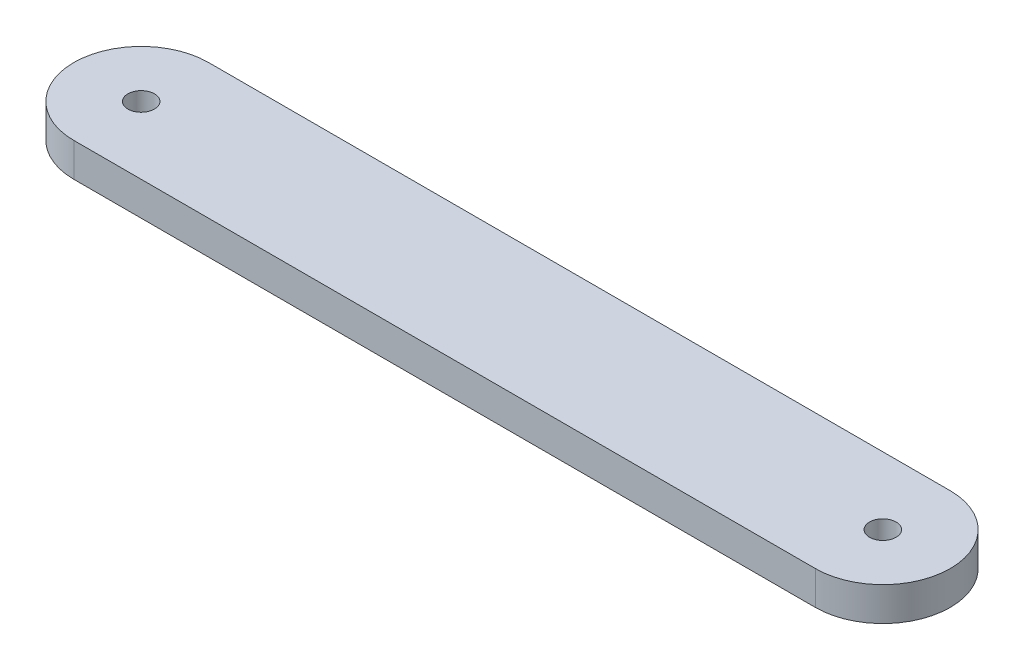
ISO-10303-21;
HEADER;
FILE_DESCRIPTION(('STEP AP214'),'2;1');
FILE_NAME('part.step','',(''),(''),'','','');
FILE_SCHEMA(('AUTOMOTIVE_DESIGN { 1 0 10303 214 1 1 1 1 }'));
ENDSEC;
DATA;
#1=APPLICATION_CONTEXT('core data for automotive mechanical design processes');
#2=APPLICATION_PROTOCOL_DEFINITION('international standard','automotive_design',2000,#1);
#3=PRODUCT_CONTEXT('',#1,'mechanical');
#4=PRODUCT('Part','Part','',(#3));
#5=PRODUCT_RELATED_PRODUCT_CATEGORY('part','',(#4));
#6=PRODUCT_DEFINITION_FORMATION('','',#4);
#7=PRODUCT_DEFINITION_CONTEXT('part definition',#1,'design');
#8=PRODUCT_DEFINITION('design','',#6,#7);
#9=PRODUCT_DEFINITION_SHAPE('','',#8);
#10=(LENGTH_UNIT() NAMED_UNIT(*) SI_UNIT(.MILLI.,.METRE.));
#11=(NAMED_UNIT(*) PLANE_ANGLE_UNIT() SI_UNIT($,.RADIAN.));
#12=(NAMED_UNIT(*) SI_UNIT($,.STERADIAN.) SOLID_ANGLE_UNIT());
#13=UNCERTAINTY_MEASURE_WITH_UNIT(LENGTH_MEASURE(1.E-05),#10,'distance_accuracy_value','');
#14=(GEOMETRIC_REPRESENTATION_CONTEXT(3) GLOBAL_UNCERTAINTY_ASSIGNED_CONTEXT((#13)) GLOBAL_UNIT_ASSIGNED_CONTEXT((#10,
#11,#12)) REPRESENTATION_CONTEXT('',''));
#15=CARTESIAN_POINT('',(0.,0.,0.));
#16=DIRECTION('',(0.,0.,1.));
#17=DIRECTION('',(1.,0.,0.));
#18=AXIS2_PLACEMENT_3D('',#15,#16,#17);
#19=CARTESIAN_POINT('',(0.,6.35,0.));
#20=DIRECTION('',(0.,-1.,0.));
#21=DIRECTION('',(0.,0.,-1.));
#22=AXIS2_PLACEMENT_3D('',#19,#20,#21);
#23=CYLINDRICAL_SURFACE('',#22,12.7);
#24=CARTESIAN_POINT('',(0.,0.,0.));
#25=DIRECTION('',(0.,1.,0.));
#26=DIRECTION('',(0.,0.,1.));
#27=AXIS2_PLACEMENT_3D('',#24,#25,#26);
#28=CIRCLE('',#27,12.7);
#29=CARTESIAN_POINT('',(0.,0.,-12.7));
#30=VERTEX_POINT('',#29);
#31=CARTESIAN_POINT('',(0.,0.,12.7));
#32=VERTEX_POINT('',#31);
#33=EDGE_CURVE('E99',#30,#32,#28,.T.);
#34=ORIENTED_EDGE('',*,*,#33,.T.);
#35=DIRECTION('',(0.,-1.,0.));
#36=VECTOR('',#35,1.);
#37=CARTESIAN_POINT('',(0.,6.35,12.7));
#38=LINE('',#37,#36);
#39=CARTESIAN_POINT('',(0.,6.35,12.7));
#40=VERTEX_POINT('',#39);
#41=EDGE_CURVE('E11',#40,#32,#38,.T.);
#42=ORIENTED_EDGE('',*,*,#41,.F.);
#43=CARTESIAN_POINT('',(0.,6.35,0.));
#44=DIRECTION('',(0.,1.,0.));
#45=DIRECTION('',(0.,0.,1.));
#46=AXIS2_PLACEMENT_3D('',#43,#44,#45);
#47=CIRCLE('',#46,12.7);
#48=CARTESIAN_POINT('',(0.,6.35,-12.7));
#49=VERTEX_POINT('',#48);
#50=EDGE_CURVE('E87',#49,#40,#47,.T.);
#51=ORIENTED_EDGE('',*,*,#50,.F.);
#52=DIRECTION('',(0.,-1.,0.));
#53=VECTOR('',#52,1.);
#54=CARTESIAN_POINT('',(0.,6.35,-12.7));
#55=LINE('',#54,#53);
#56=EDGE_CURVE('E95',#49,#30,#55,.T.);
#57=ORIENTED_EDGE('',*,*,#56,.T.);
#58=EDGE_LOOP('',(#34,#42,#51,#57));
#59=FACE_BOUND('',#58,.T.);
#60=ADVANCED_FACE('F36',(#59),#23,.T.);
#61=CARTESIAN_POINT('',(0.,6.35,12.7));
#62=DIRECTION('',(0.,0.,-1.));
#63=DIRECTION('',(-1.,0.,0.));
#64=AXIS2_PLACEMENT_3D('',#61,#62,#63);
#65=PLANE('',#64);
#66=DIRECTION('',(1.,0.,0.));
#67=VECTOR('',#66,1.);
#68=CARTESIAN_POINT('',(0.,0.,12.7));
#69=LINE('',#68,#67);
#70=CARTESIAN_POINT('',(139.7,0.,12.7));
#71=VERTEX_POINT('',#70);
#72=EDGE_CURVE('E91',#32,#71,#69,.T.);
#73=ORIENTED_EDGE('',*,*,#72,.T.);
#74=DIRECTION('',(0.,-1.,0.));
#75=VECTOR('',#74,1.);
#76=CARTESIAN_POINT('',(139.7,6.35,12.7));
#77=LINE('',#76,#75);
#78=CARTESIAN_POINT('',(139.7,6.35,12.7));
#79=VERTEX_POINT('',#78);
#80=EDGE_CURVE('E44',#79,#71,#77,.T.);
#81=ORIENTED_EDGE('',*,*,#80,.F.);
#82=DIRECTION('',(1.,0.,0.));
#83=VECTOR('',#82,1.);
#84=CARTESIAN_POINT('',(0.,6.35,12.7));
#85=LINE('',#84,#83);
#86=EDGE_CURVE('E82',#40,#79,#85,.T.);
#87=ORIENTED_EDGE('',*,*,#86,.F.);
#88=ORIENTED_EDGE('',*,*,#41,.T.);
#89=EDGE_LOOP('',(#73,#81,#87,#88));
#90=FACE_BOUND('',#89,.T.);
#91=ADVANCED_FACE('F90',(#90),#65,.F.);
#92=CARTESIAN_POINT('',(139.7,6.35,0.));
#93=DIRECTION('',(0.,-1.,0.));
#94=DIRECTION('',(0.,0.,-1.));
#95=AXIS2_PLACEMENT_3D('',#92,#93,#94);
#96=CYLINDRICAL_SURFACE('',#95,12.7);
#97=CARTESIAN_POINT('',(139.7,0.,0.));
#98=DIRECTION('',(0.,1.,0.));
#99=DIRECTION('',(0.,0.,1.));
#100=AXIS2_PLACEMENT_3D('',#97,#98,#99);
#101=CIRCLE('',#100,12.7);
#102=CARTESIAN_POINT('',(139.7,0.,-12.7));
#103=VERTEX_POINT('',#102);
#104=EDGE_CURVE('E69',#71,#103,#101,.T.);
#105=ORIENTED_EDGE('',*,*,#104,.T.);
#106=DIRECTION('',(0.,-1.,0.));
#107=VECTOR('',#106,1.);
#108=CARTESIAN_POINT('',(139.7,6.35,-12.7));
#109=LINE('',#108,#107);
#110=CARTESIAN_POINT('',(139.7,6.35,-12.7));
#111=VERTEX_POINT('',#110);
#112=EDGE_CURVE('E92',#111,#103,#109,.T.);
#113=ORIENTED_EDGE('',*,*,#112,.F.);
#114=CARTESIAN_POINT('',(139.7,6.35,0.));
#115=DIRECTION('',(0.,1.,0.));
#116=DIRECTION('',(0.,0.,1.));
#117=AXIS2_PLACEMENT_3D('',#114,#115,#116);
#118=CIRCLE('',#117,12.7);
#119=EDGE_CURVE('E85',#79,#111,#118,.T.);
#120=ORIENTED_EDGE('',*,*,#119,.F.);
#121=ORIENTED_EDGE('',*,*,#80,.T.);
#122=EDGE_LOOP('',(#105,#113,#120,#121));
#123=FACE_BOUND('',#122,.T.);
#124=ADVANCED_FACE('F93',(#123),#96,.T.);
#125=CARTESIAN_POINT('',(0.,6.35,-12.7));
#126=DIRECTION('',(0.,0.,1.));
#127=DIRECTION('',(1.,0.,0.));
#128=AXIS2_PLACEMENT_3D('',#125,#126,#127);
#129=PLANE('',#128);
#130=DIRECTION('',(-1.,0.,0.));
#131=VECTOR('',#130,1.);
#132=CARTESIAN_POINT('',(0.,0.,-12.7));
#133=LINE('',#132,#131);
#134=EDGE_CURVE('E75',#103,#30,#133,.T.);
#135=ORIENTED_EDGE('',*,*,#134,.T.);
#136=ORIENTED_EDGE('',*,*,#56,.F.);
#137=DIRECTION('',(-1.,0.,0.));
#138=VECTOR('',#137,1.);
#139=CARTESIAN_POINT('',(0.,6.35,-12.7));
#140=LINE('',#139,#138);
#141=EDGE_CURVE('E52',#111,#49,#140,.T.);
#142=ORIENTED_EDGE('',*,*,#141,.F.);
#143=ORIENTED_EDGE('',*,*,#112,.T.);
#144=EDGE_LOOP('',(#135,#136,#142,#143));
#145=FACE_BOUND('',#144,.T.);
#146=ADVANCED_FACE('F107',(#145),#129,.F.);
#147=CARTESIAN_POINT('',(0.,6.35,0.));
#148=DIRECTION('',(0.,1.,0.));
#149=DIRECTION('',(0.,0.,1.));
#150=AXIS2_PLACEMENT_3D('',#147,#148,#149);
#151=PLANE('',#150);
#152=CARTESIAN_POINT('',(139.7,6.35,0.));
#153=DIRECTION('',(0.,1.,0.));
#154=DIRECTION('',(0.,0.,1.));
#155=AXIS2_PLACEMENT_3D('',#152,#153,#154);
#156=CIRCLE('',#155,2.499999953);
#157=CARTESIAN_POINT('',(139.7,6.35,2.499999953));
#158=VERTEX_POINT('',#157);
#159=EDGE_CURVE('E119',#158,#158,#156,.T.);
#160=ORIENTED_EDGE('',*,*,#159,.F.);
#161=EDGE_LOOP('',(#160));
#162=FACE_BOUND('',#161,.T.);
#163=CARTESIAN_POINT('',(0.,6.35,0.));
#164=DIRECTION('',(0.,1.,0.));
#165=DIRECTION('',(0.,0.,1.));
#166=AXIS2_PLACEMENT_3D('',#163,#164,#165);
#167=CIRCLE('',#166,2.499999953);
#168=CARTESIAN_POINT('',(0.,6.35,2.499999953));
#169=VERTEX_POINT('',#168);
#170=EDGE_CURVE('E113',#169,#169,#167,.T.);
#171=ORIENTED_EDGE('',*,*,#170,.F.);
#172=EDGE_LOOP('',(#171));
#173=FACE_BOUND('',#172,.T.);
#174=ORIENTED_EDGE('',*,*,#50,.T.);
#175=ORIENTED_EDGE('',*,*,#86,.T.);
#176=ORIENTED_EDGE('',*,*,#119,.T.);
#177=ORIENTED_EDGE('',*,*,#141,.T.);
#178=EDGE_LOOP('',(#174,#175,#176,#177));
#179=FACE_BOUND('',#178,.T.);
#180=ADVANCED_FACE('F83',(#162,#173,#179),#151,.T.);
#181=CARTESIAN_POINT('',(0.,0.,0.));
#182=DIRECTION('',(0.,1.,0.));
#183=DIRECTION('',(0.,0.,1.));
#184=AXIS2_PLACEMENT_3D('',#181,#182,#183);
#185=PLANE('',#184);
#186=CARTESIAN_POINT('',(139.7,0.,0.));
#187=DIRECTION('',(0.,1.,0.));
#188=DIRECTION('',(0.,0.,1.));
#189=AXIS2_PLACEMENT_3D('',#186,#187,#188);
#190=CIRCLE('',#189,2.499999953);
#191=CARTESIAN_POINT('',(139.7,0.,2.499999953));
#192=VERTEX_POINT('',#191);
#193=EDGE_CURVE('E116',#192,#192,#190,.T.);
#194=ORIENTED_EDGE('',*,*,#193,.T.);
#195=EDGE_LOOP('',(#194));
#196=FACE_BOUND('',#195,.T.);
#197=CARTESIAN_POINT('',(0.,0.,0.));
#198=DIRECTION('',(0.,1.,0.));
#199=DIRECTION('',(0.,0.,1.));
#200=AXIS2_PLACEMENT_3D('',#197,#198,#199);
#201=CIRCLE('',#200,2.499999953);
#202=CARTESIAN_POINT('',(0.,0.,2.499999953));
#203=VERTEX_POINT('',#202);
#204=EDGE_CURVE('E102',#203,#203,#201,.T.);
#205=ORIENTED_EDGE('',*,*,#204,.T.);
#206=EDGE_LOOP('',(#205));
#207=FACE_BOUND('',#206,.T.);
#208=ORIENTED_EDGE('',*,*,#33,.F.);
#209=ORIENTED_EDGE('',*,*,#134,.F.);
#210=ORIENTED_EDGE('',*,*,#104,.F.);
#211=ORIENTED_EDGE('',*,*,#72,.F.);
#212=EDGE_LOOP('',(#208,#209,#210,#211));
#213=FACE_BOUND('',#212,.T.);
#214=ADVANCED_FACE('F110',(#196,#207,#213),#185,.F.);
#215=CARTESIAN_POINT('',(0.,0.,0.));
#216=DIRECTION('',(0.,1.,0.));
#217=DIRECTION('',(0.,0.,1.));
#218=AXIS2_PLACEMENT_3D('',#215,#216,#217);
#219=CYLINDRICAL_SURFACE('',#218,2.499999953);
#220=ORIENTED_EDGE('',*,*,#204,.F.);
#221=EDGE_LOOP('',(#220));
#222=FACE_BOUND('',#221,.T.);
#223=ORIENTED_EDGE('',*,*,#170,.T.);
#224=EDGE_LOOP('',(#223));
#225=FACE_BOUND('',#224,.T.);
#226=ADVANCED_FACE('F130',(#222,#225),#219,.F.);
#227=CARTESIAN_POINT('',(139.7,0.,0.));
#228=DIRECTION('',(0.,1.,0.));
#229=DIRECTION('',(0.,0.,1.));
#230=AXIS2_PLACEMENT_3D('',#227,#228,#229);
#231=CYLINDRICAL_SURFACE('',#230,2.499999953);
#232=ORIENTED_EDGE('',*,*,#193,.F.);
#233=EDGE_LOOP('',(#232));
#234=FACE_BOUND('',#233,.T.);
#235=ORIENTED_EDGE('',*,*,#159,.T.);
#236=EDGE_LOOP('',(#235));
#237=FACE_BOUND('',#236,.T.);
#238=ADVANCED_FACE('F127',(#234,#237),#231,.F.);
#239=CLOSED_SHELL('',(#60,#91,#124,#146,#180,#214,#226,#238));
#240=MANIFOLD_SOLID_BREP('B2',#239);
#241=ADVANCED_BREP_SHAPE_REPRESENTATION('',(#18,#240),#14);
#242=SHAPE_DEFINITION_REPRESENTATION(#9,#241);
ENDSEC;
END-ISO-10303-21;
